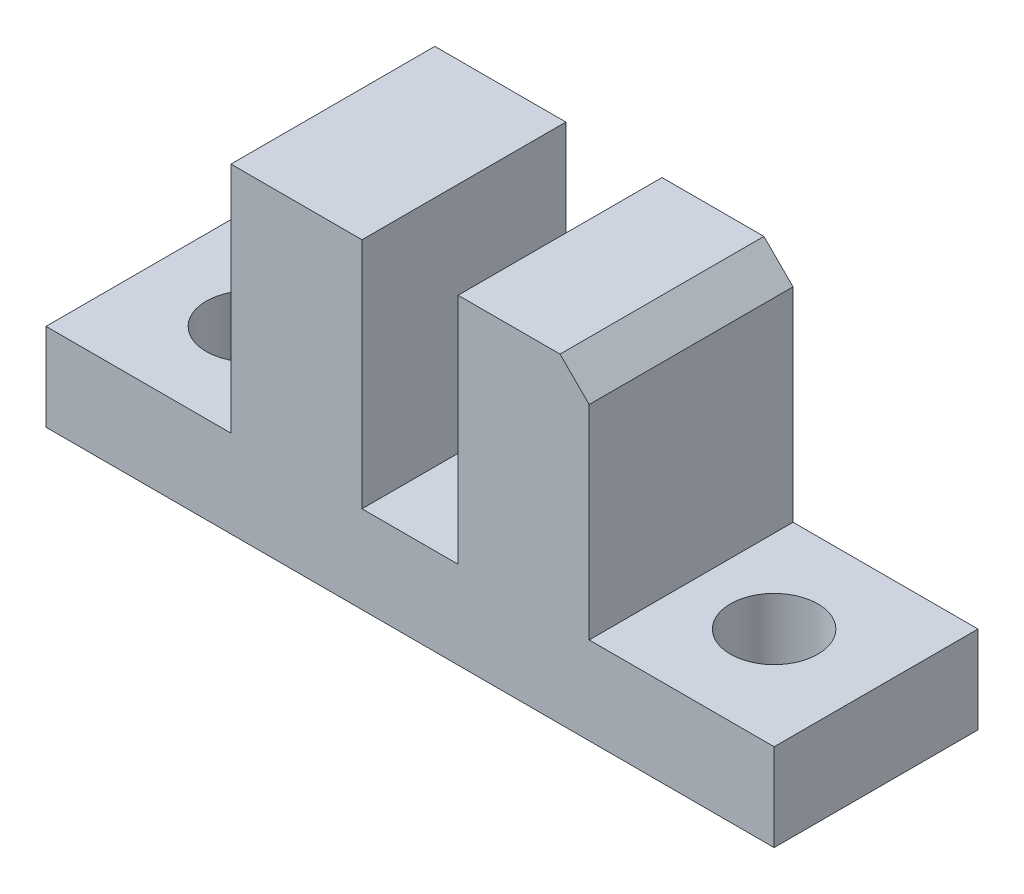
ISO-10303-21;
HEADER;
FILE_DESCRIPTION(('STEP AP214'),'2;1');
FILE_NAME('part.step','',(''),(''),'','','');
FILE_SCHEMA(('AUTOMOTIVE_DESIGN { 1 0 10303 214 1 1 1 1 }'));
ENDSEC;
DATA;
#1=APPLICATION_CONTEXT('core data for automotive mechanical design processes');
#2=APPLICATION_PROTOCOL_DEFINITION('international standard','automotive_design',2000,#1);
#3=PRODUCT_CONTEXT('',#1,'mechanical');
#4=PRODUCT('Part','Part','',(#3));
#5=PRODUCT_RELATED_PRODUCT_CATEGORY('part','',(#4));
#6=PRODUCT_DEFINITION_FORMATION('','',#4);
#7=PRODUCT_DEFINITION_CONTEXT('part definition',#1,'design');
#8=PRODUCT_DEFINITION('design','',#6,#7);
#9=PRODUCT_DEFINITION_SHAPE('','',#8);
#10=(LENGTH_UNIT() NAMED_UNIT(*) SI_UNIT(.MILLI.,.METRE.));
#11=(NAMED_UNIT(*) PLANE_ANGLE_UNIT() SI_UNIT($,.RADIAN.));
#12=(NAMED_UNIT(*) SI_UNIT($,.STERADIAN.) SOLID_ANGLE_UNIT());
#13=UNCERTAINTY_MEASURE_WITH_UNIT(LENGTH_MEASURE(1.E-05),#10,'distance_accuracy_value','');
#14=(GEOMETRIC_REPRESENTATION_CONTEXT(3) GLOBAL_UNCERTAINTY_ASSIGNED_CONTEXT((#13)) GLOBAL_UNIT_ASSIGNED_CONTEXT((#10,
#11,#12)) REPRESENTATION_CONTEXT('',''));
#15=CARTESIAN_POINT('',(0.,0.,0.));
#16=DIRECTION('',(0.,0.,1.));
#17=DIRECTION('',(1.,0.,0.));
#18=AXIS2_PLACEMENT_3D('',#15,#16,#17);
#19=CARTESIAN_POINT('',(0.,3.,0.));
#20=DIRECTION('',(0.,-1.,0.));
#21=DIRECTION('',(0.,0.,-1.));
#22=AXIS2_PLACEMENT_3D('',#19,#20,#21);
#23=PLANE('',#22);
#24=CARTESIAN_POINT('',(-9.00000000000001,3.,0.));
#25=DIRECTION('',(0.,1.,0.));
#26=DIRECTION('',(0.,0.,-1.));
#27=AXIS2_PLACEMENT_3D('',#24,#25,#26);
#28=CIRCLE('',#27,1.5);
#29=CARTESIAN_POINT('',(-9.00000000000001,3.,-1.5));
#30=VERTEX_POINT('',#29);
#31=EDGE_CURVE('E189',#30,#30,#28,.T.);
#32=ORIENTED_EDGE('',*,*,#31,.F.);
#33=EDGE_LOOP('',(#32));
#34=FACE_BOUND('',#33,.T.);
#35=DIRECTION('',(1.,0.,0.));
#36=VECTOR('',#35,1.);
#37=CARTESIAN_POINT('',(-12.5,3.,3.5));
#38=LINE('',#37,#36);
#39=CARTESIAN_POINT('',(-12.5,3.,3.5));
#40=VERTEX_POINT('',#39);
#41=CARTESIAN_POINT('',(-6.15,3.,3.5));
#42=VERTEX_POINT('',#41);
#43=EDGE_CURVE('E212',#40,#42,#38,.T.);
#44=ORIENTED_EDGE('',*,*,#43,.T.);
#45=DIRECTION('',(0.,0.,-1.));
#46=VECTOR('',#45,1.);
#47=CARTESIAN_POINT('',(-6.15,3.,0.));
#48=LINE('',#47,#46);
#49=CARTESIAN_POINT('',(-6.15,3.,-3.5));
#50=VERTEX_POINT('',#49);
#51=EDGE_CURVE('E164',#42,#50,#48,.T.);
#52=ORIENTED_EDGE('',*,*,#51,.T.);
#53=DIRECTION('',(-1.,0.,0.));
#54=VECTOR('',#53,1.);
#55=CARTESIAN_POINT('',(-12.5,3.,-3.5));
#56=LINE('',#55,#54);
#57=CARTESIAN_POINT('',(-12.5,3.,-3.5));
#58=VERTEX_POINT('',#57);
#59=EDGE_CURVE('E132',#50,#58,#56,.T.);
#60=ORIENTED_EDGE('',*,*,#59,.T.);
#61=DIRECTION('',(0.,0.,1.));
#62=VECTOR('',#61,1.);
#63=CARTESIAN_POINT('',(-12.5,3.,3.5));
#64=LINE('',#63,#62);
#65=EDGE_CURVE('E208',#58,#40,#64,.T.);
#66=ORIENTED_EDGE('',*,*,#65,.T.);
#67=EDGE_LOOP('',(#44,#52,#60,#66));
#68=FACE_BOUND('',#67,.T.);
#69=ADVANCED_FACE('F32',(#34,#68),#23,.F.);
#70=CARTESIAN_POINT('',(9.,3.,0.));
#71=DIRECTION('',(0.,1.,0.));
#72=DIRECTION('',(0.,0.,1.));
#73=AXIS2_PLACEMENT_3D('',#70,#71,#72);
#74=CIRCLE('',#73,1.5);
#75=CARTESIAN_POINT('',(9.,3.,1.5));
#76=VERTEX_POINT('',#75);
#77=EDGE_CURVE('E195',#76,#76,#74,.T.);
#78=ORIENTED_EDGE('',*,*,#77,.F.);
#79=EDGE_LOOP('',(#78));
#80=FACE_BOUND('',#79,.T.);
#81=CARTESIAN_POINT('',(12.5,3.,-3.5));
#82=VERTEX_POINT('',#81);
#83=CARTESIAN_POINT('',(6.15,3.,-3.5));
#84=VERTEX_POINT('',#83);
#85=EDGE_CURVE('E205',#82,#84,#56,.T.);
#86=ORIENTED_EDGE('',*,*,#85,.T.);
#87=DIRECTION('',(0.,0.,1.));
#88=VECTOR('',#87,1.);
#89=CARTESIAN_POINT('',(6.15,3.,0.));
#90=LINE('',#89,#88);
#91=CARTESIAN_POINT('',(6.15,3.,3.5));
#92=VERTEX_POINT('',#91);
#93=EDGE_CURVE('E185',#84,#92,#90,.T.);
#94=ORIENTED_EDGE('',*,*,#93,.T.);
#95=CARTESIAN_POINT('',(12.5,3.,3.5));
#96=VERTEX_POINT('',#95);
#97=EDGE_CURVE('E211',#92,#96,#38,.T.);
#98=ORIENTED_EDGE('',*,*,#97,.T.);
#99=DIRECTION('',(0.,0.,-1.));
#100=VECTOR('',#99,1.);
#101=CARTESIAN_POINT('',(12.5,3.,3.5));
#102=LINE('',#101,#100);
#103=EDGE_CURVE('E201',#96,#82,#102,.T.);
#104=ORIENTED_EDGE('',*,*,#103,.T.);
#105=EDGE_LOOP('',(#86,#94,#98,#104));
#106=FACE_BOUND('',#105,.T.);
#107=ADVANCED_FACE('F279',(#80,#106),#23,.F.);
#108=CARTESIAN_POINT('',(1.65,3.,-3.5));
#109=VERTEX_POINT('',#108);
#110=CARTESIAN_POINT('',(-1.65,3.,-3.5));
#111=VERTEX_POINT('',#110);
#112=EDGE_CURVE('E209',#109,#111,#56,.T.);
#113=ORIENTED_EDGE('',*,*,#112,.T.);
#114=DIRECTION('',(0.,0.,1.));
#115=VECTOR('',#114,1.);
#116=CARTESIAN_POINT('',(-1.65,3.,0.));
#117=LINE('',#116,#115);
#118=CARTESIAN_POINT('',(-1.65,3.,3.5));
#119=VERTEX_POINT('',#118);
#120=EDGE_CURVE('E158',#111,#119,#117,.T.);
#121=ORIENTED_EDGE('',*,*,#120,.T.);
#122=CARTESIAN_POINT('',(1.65,3.,3.5));
#123=VERTEX_POINT('',#122);
#124=EDGE_CURVE('E215',#119,#123,#38,.T.);
#125=ORIENTED_EDGE('',*,*,#124,.T.);
#126=DIRECTION('',(0.,0.,-1.));
#127=VECTOR('',#126,1.);
#128=CARTESIAN_POINT('',(1.65,3.,0.));
#129=LINE('',#128,#127);
#130=EDGE_CURVE('E176',#123,#109,#129,.T.);
#131=ORIENTED_EDGE('',*,*,#130,.T.);
#132=EDGE_LOOP('',(#113,#121,#125,#131));
#133=FACE_BOUND('',#132,.T.);
#134=ADVANCED_FACE('F252',(#133),#23,.F.);
#135=CARTESIAN_POINT('',(0.,0.,0.));
#136=DIRECTION('',(0.,-1.,0.));
#137=DIRECTION('',(0.,0.,-1.));
#138=AXIS2_PLACEMENT_3D('',#135,#136,#137);
#139=PLANE('',#138);
#140=DIRECTION('',(0.,0.,-1.));
#141=VECTOR('',#140,1.);
#142=CARTESIAN_POINT('',(12.5,0.,3.5));
#143=LINE('',#142,#141);
#144=CARTESIAN_POINT('',(12.5,0.,3.5));
#145=VERTEX_POINT('',#144);
#146=CARTESIAN_POINT('',(12.5,0.,-3.5));
#147=VERTEX_POINT('',#146);
#148=EDGE_CURVE('E198',#145,#147,#143,.T.);
#149=ORIENTED_EDGE('',*,*,#148,.F.);
#150=DIRECTION('',(1.,0.,0.));
#151=VECTOR('',#150,1.);
#152=CARTESIAN_POINT('',(-12.5,0.,3.5));
#153=LINE('',#152,#151);
#154=CARTESIAN_POINT('',(-12.5,0.,3.5));
#155=VERTEX_POINT('',#154);
#156=EDGE_CURVE('E204',#155,#145,#153,.T.);
#157=ORIENTED_EDGE('',*,*,#156,.F.);
#158=DIRECTION('',(0.,0.,1.));
#159=VECTOR('',#158,1.);
#160=CARTESIAN_POINT('',(-12.5,0.,3.5));
#161=LINE('',#160,#159);
#162=CARTESIAN_POINT('',(-12.5,0.,-3.5));
#163=VERTEX_POINT('',#162);
#164=EDGE_CURVE('E220',#163,#155,#161,.T.);
#165=ORIENTED_EDGE('',*,*,#164,.F.);
#166=DIRECTION('',(-1.,0.,0.));
#167=VECTOR('',#166,1.);
#168=CARTESIAN_POINT('',(-12.5,0.,-3.5));
#169=LINE('',#168,#167);
#170=EDGE_CURVE('E218',#147,#163,#169,.T.);
#171=ORIENTED_EDGE('',*,*,#170,.F.);
#172=EDGE_LOOP('',(#149,#157,#165,#171));
#173=FACE_BOUND('',#172,.T.);
#174=CARTESIAN_POINT('',(9.,0.,0.));
#175=DIRECTION('',(0.,1.,0.));
#176=DIRECTION('',(0.,0.,1.));
#177=AXIS2_PLACEMENT_3D('',#174,#175,#176);
#178=CIRCLE('',#177,1.5);
#179=CARTESIAN_POINT('',(9.,0.,1.5));
#180=VERTEX_POINT('',#179);
#181=EDGE_CURVE('E192',#180,#180,#178,.T.);
#182=ORIENTED_EDGE('',*,*,#181,.T.);
#183=EDGE_LOOP('',(#182));
#184=FACE_BOUND('',#183,.T.);
#185=CARTESIAN_POINT('',(-9.00000000000001,0.,0.));
#186=DIRECTION('',(0.,1.,0.));
#187=DIRECTION('',(0.,0.,-1.));
#188=AXIS2_PLACEMENT_3D('',#185,#186,#187);
#189=CIRCLE('',#188,1.5);
#190=CARTESIAN_POINT('',(-9.00000000000001,0.,-1.5));
#191=VERTEX_POINT('',#190);
#192=EDGE_CURVE('E188',#191,#191,#189,.T.);
#193=ORIENTED_EDGE('',*,*,#192,.T.);
#194=EDGE_LOOP('',(#193));
#195=FACE_BOUND('',#194,.T.);
#196=ADVANCED_FACE('F290',(#173,#184,#195),#139,.T.);
#197=CARTESIAN_POINT('',(12.5,3.,3.5));
#198=DIRECTION('',(-1.,0.,0.));
#199=DIRECTION('',(0.,0.,1.));
#200=AXIS2_PLACEMENT_3D('',#197,#198,#199);
#201=PLANE('',#200);
#202=ORIENTED_EDGE('',*,*,#148,.T.);
#203=DIRECTION('',(0.,-1.,0.));
#204=VECTOR('',#203,1.);
#205=CARTESIAN_POINT('',(12.5,3.,-3.5));
#206=LINE('',#205,#204);
#207=EDGE_CURVE('E231',#82,#147,#206,.T.);
#208=ORIENTED_EDGE('',*,*,#207,.F.);
#209=ORIENTED_EDGE('',*,*,#103,.F.);
#210=DIRECTION('',(0.,-1.,0.));
#211=VECTOR('',#210,1.);
#212=CARTESIAN_POINT('',(12.5,3.,3.5));
#213=LINE('',#212,#211);
#214=EDGE_CURVE('E214',#96,#145,#213,.T.);
#215=ORIENTED_EDGE('',*,*,#214,.T.);
#216=EDGE_LOOP('',(#202,#208,#209,#215));
#217=FACE_BOUND('',#216,.T.);
#218=ADVANCED_FACE('F294',(#217),#201,.F.);
#219=CARTESIAN_POINT('',(-12.5,3.,-3.5));
#220=DIRECTION('',(0.,0.,1.));
#221=DIRECTION('',(1.,0.,0.));
#222=AXIS2_PLACEMENT_3D('',#219,#220,#221);
#223=PLANE('',#222);
#224=DIRECTION('',(1.,0.,0.));
#225=VECTOR('',#224,1.);
#226=CARTESIAN_POINT('',(1.65,11.,-3.5));
#227=LINE('',#226,#225);
#228=CARTESIAN_POINT('',(1.65,11.,-3.5));
#229=VERTEX_POINT('',#228);
#230=CARTESIAN_POINT('',(5.15,11.,-3.5));
#231=VERTEX_POINT('',#230);
#232=EDGE_CURVE('E171',#229,#231,#227,.T.);
#233=ORIENTED_EDGE('',*,*,#232,.T.);
#234=DIRECTION('',(0.707106781186549,-0.707106781186546,0.));
#235=VECTOR('',#234,1.);
#236=CARTESIAN_POINT('',(6.15,10.,-3.5));
#237=LINE('',#236,#235);
#238=CARTESIAN_POINT('',(6.15,10.,-3.5));
#239=VERTEX_POINT('',#238);
#240=EDGE_CURVE('E11',#231,#239,#237,.T.);
#241=ORIENTED_EDGE('',*,*,#240,.T.);
#242=DIRECTION('',(0.,-1.,0.));
#243=VECTOR('',#242,1.);
#244=CARTESIAN_POINT('',(6.15,11.,-3.5));
#245=LINE('',#244,#243);
#246=EDGE_CURVE('E177',#239,#84,#245,.T.);
#247=ORIENTED_EDGE('',*,*,#246,.T.);
#248=ORIENTED_EDGE('',*,*,#85,.F.);
#249=ORIENTED_EDGE('',*,*,#207,.T.);
#250=ORIENTED_EDGE('',*,*,#170,.T.);
#251=DIRECTION('',(0.,-1.,0.));
#252=VECTOR('',#251,1.);
#253=CARTESIAN_POINT('',(-12.5,3.,-3.5));
#254=LINE('',#253,#252);
#255=EDGE_CURVE('E228',#58,#163,#254,.T.);
#256=ORIENTED_EDGE('',*,*,#255,.F.);
#257=ORIENTED_EDGE('',*,*,#59,.F.);
#258=DIRECTION('',(0.,-1.,0.));
#259=VECTOR('',#258,1.);
#260=CARTESIAN_POINT('',(-6.15,11.,-3.5));
#261=LINE('',#260,#259);
#262=CARTESIAN_POINT('',(-6.15,11.,-3.5));
#263=VERTEX_POINT('',#262);
#264=EDGE_CURVE('E126',#263,#50,#261,.T.);
#265=ORIENTED_EDGE('',*,*,#264,.F.);
#266=DIRECTION('',(1.,0.,0.));
#267=VECTOR('',#266,1.);
#268=CARTESIAN_POINT('',(-6.15,11.,-3.5));
#269=LINE('',#268,#267);
#270=CARTESIAN_POINT('',(-1.65,11.,-3.5));
#271=VERTEX_POINT('',#270);
#272=EDGE_CURVE('E130',#263,#271,#269,.T.);
#273=ORIENTED_EDGE('',*,*,#272,.T.);
#274=DIRECTION('',(0.,-1.,0.));
#275=VECTOR('',#274,1.);
#276=CARTESIAN_POINT('',(-1.65,11.,-3.5));
#277=LINE('',#276,#275);
#278=EDGE_CURVE('E137',#271,#111,#277,.T.);
#279=ORIENTED_EDGE('',*,*,#278,.T.);
#280=ORIENTED_EDGE('',*,*,#112,.F.);
#281=DIRECTION('',(0.,-1.,0.));
#282=VECTOR('',#281,1.);
#283=CARTESIAN_POINT('',(1.65,11.,-3.5));
#284=LINE('',#283,#282);
#285=EDGE_CURVE('E179',#229,#109,#284,.T.);
#286=ORIENTED_EDGE('',*,*,#285,.F.);
#287=EDGE_LOOP('',(#233,#241,#247,#248,#249,#250,#256,#257,#265,#273,#279,#280,#286));
#288=FACE_BOUND('',#287,.T.);
#289=ADVANCED_FACE('F128',(#288),#223,.F.);
#290=CARTESIAN_POINT('',(-12.5,3.,3.5));
#291=DIRECTION('',(1.,0.,0.));
#292=DIRECTION('',(0.,0.,-1.));
#293=AXIS2_PLACEMENT_3D('',#290,#291,#292);
#294=PLANE('',#293);
#295=ORIENTED_EDGE('',*,*,#164,.T.);
#296=DIRECTION('',(0.,-1.,0.));
#297=VECTOR('',#296,1.);
#298=CARTESIAN_POINT('',(-12.5,3.,3.5));
#299=LINE('',#298,#297);
#300=EDGE_CURVE('E225',#40,#155,#299,.T.);
#301=ORIENTED_EDGE('',*,*,#300,.F.);
#302=ORIENTED_EDGE('',*,*,#65,.F.);
#303=ORIENTED_EDGE('',*,*,#255,.T.);
#304=EDGE_LOOP('',(#295,#301,#302,#303));
#305=FACE_BOUND('',#304,.T.);
#306=ADVANCED_FACE('F265',(#305),#294,.F.);
#307=CARTESIAN_POINT('',(-12.5,3.,3.5));
#308=DIRECTION('',(0.,0.,-1.));
#309=DIRECTION('',(-1.,0.,0.));
#310=AXIS2_PLACEMENT_3D('',#307,#308,#309);
#311=PLANE('',#310);
#312=DIRECTION('',(0.,-1.,0.));
#313=VECTOR('',#312,1.);
#314=CARTESIAN_POINT('',(6.15,11.,3.5));
#315=LINE('',#314,#313);
#316=CARTESIAN_POINT('',(6.15,10.,3.5));
#317=VERTEX_POINT('',#316);
#318=EDGE_CURVE('E174',#317,#92,#315,.T.);
#319=ORIENTED_EDGE('',*,*,#318,.F.);
#320=DIRECTION('',(-0.707106781186549,0.707106781186546,0.));
#321=VECTOR('',#320,1.);
#322=CARTESIAN_POINT('',(6.15,10.,3.5));
#323=LINE('',#322,#321);
#324=CARTESIAN_POINT('',(5.15,11.,3.5));
#325=VERTEX_POINT('',#324);
#326=EDGE_CURVE('E54',#317,#325,#323,.T.);
#327=ORIENTED_EDGE('',*,*,#326,.T.);
#328=DIRECTION('',(-1.,0.,0.));
#329=VECTOR('',#328,1.);
#330=CARTESIAN_POINT('',(1.65,11.,3.5));
#331=LINE('',#330,#329);
#332=CARTESIAN_POINT('',(1.65,11.,3.5));
#333=VERTEX_POINT('',#332);
#334=EDGE_CURVE('E166',#325,#333,#331,.T.);
#335=ORIENTED_EDGE('',*,*,#334,.T.);
#336=DIRECTION('',(0.,-1.,0.));
#337=VECTOR('',#336,1.);
#338=CARTESIAN_POINT('',(1.65,11.,3.5));
#339=LINE('',#338,#337);
#340=EDGE_CURVE('E173',#333,#123,#339,.T.);
#341=ORIENTED_EDGE('',*,*,#340,.T.);
#342=ORIENTED_EDGE('',*,*,#124,.F.);
#343=DIRECTION('',(0.,-1.,0.));
#344=VECTOR('',#343,1.);
#345=CARTESIAN_POINT('',(-1.65,11.,3.5));
#346=LINE('',#345,#344);
#347=CARTESIAN_POINT('',(-1.65,11.,3.5));
#348=VERTEX_POINT('',#347);
#349=EDGE_CURVE('E159',#348,#119,#346,.T.);
#350=ORIENTED_EDGE('',*,*,#349,.F.);
#351=DIRECTION('',(-1.,0.,0.));
#352=VECTOR('',#351,1.);
#353=CARTESIAN_POINT('',(-6.15,11.,3.5));
#354=LINE('',#353,#352);
#355=CARTESIAN_POINT('',(-6.15,11.,3.5));
#356=VERTEX_POINT('',#355);
#357=EDGE_CURVE('E138',#348,#356,#354,.T.);
#358=ORIENTED_EDGE('',*,*,#357,.T.);
#359=DIRECTION('',(0.,-1.,0.));
#360=VECTOR('',#359,1.);
#361=CARTESIAN_POINT('',(-6.15,11.,3.5));
#362=LINE('',#361,#360);
#363=EDGE_CURVE('E152',#356,#42,#362,.T.);
#364=ORIENTED_EDGE('',*,*,#363,.T.);
#365=ORIENTED_EDGE('',*,*,#43,.F.);
#366=ORIENTED_EDGE('',*,*,#300,.T.);
#367=ORIENTED_EDGE('',*,*,#156,.T.);
#368=ORIENTED_EDGE('',*,*,#214,.F.);
#369=ORIENTED_EDGE('',*,*,#97,.F.);
#370=EDGE_LOOP('',(#319,#327,#335,#341,#342,#350,#358,#364,#365,#366,#367,#368,#369));
#371=FACE_BOUND('',#370,.T.);
#372=ADVANCED_FACE('F245',(#371),#311,.F.);
#373=CARTESIAN_POINT('',(9.,3.,0.));
#374=DIRECTION('',(0.,-1.,0.));
#375=DIRECTION('',(0.,0.,-1.));
#376=AXIS2_PLACEMENT_3D('',#373,#374,#375);
#377=CYLINDRICAL_SURFACE('',#376,1.5);
#378=ORIENTED_EDGE('',*,*,#77,.T.);
#379=EDGE_LOOP('',(#378));
#380=FACE_BOUND('',#379,.T.);
#381=ORIENTED_EDGE('',*,*,#181,.F.);
#382=EDGE_LOOP('',(#381));
#383=FACE_BOUND('',#382,.T.);
#384=ADVANCED_FACE('F305',(#380,#383),#377,.F.);
#385=CARTESIAN_POINT('',(-9.00000000000001,3.,0.));
#386=DIRECTION('',(0.,-1.,0.));
#387=DIRECTION('',(0.,0.,-1.));
#388=AXIS2_PLACEMENT_3D('',#385,#386,#387);
#389=CYLINDRICAL_SURFACE('',#388,1.5);
#390=ORIENTED_EDGE('',*,*,#31,.T.);
#391=EDGE_LOOP('',(#390));
#392=FACE_BOUND('',#391,.T.);
#393=ORIENTED_EDGE('',*,*,#192,.F.);
#394=EDGE_LOOP('',(#393));
#395=FACE_BOUND('',#394,.T.);
#396=ADVANCED_FACE('F329',(#392,#395),#389,.F.);
#397=CARTESIAN_POINT('',(6.15,11.,-3.5));
#398=DIRECTION('',(1.,0.,0.));
#399=DIRECTION('',(0.,0.,-1.));
#400=AXIS2_PLACEMENT_3D('',#397,#398,#399);
#401=PLANE('',#400);
#402=ORIENTED_EDGE('',*,*,#246,.F.);
#403=DIRECTION('',(0.,0.,1.));
#404=VECTOR('',#403,1.);
#405=CARTESIAN_POINT('',(6.15,10.,3.5));
#406=LINE('',#405,#404);
#407=EDGE_CURVE('E234',#239,#317,#406,.T.);
#408=ORIENTED_EDGE('',*,*,#407,.T.);
#409=ORIENTED_EDGE('',*,*,#318,.T.);
#410=ORIENTED_EDGE('',*,*,#93,.F.);
#411=EDGE_LOOP('',(#402,#408,#409,#410));
#412=FACE_BOUND('',#411,.T.);
#413=ADVANCED_FACE('F240',(#412),#401,.T.);
#414=CARTESIAN_POINT('',(1.65,11.,-3.5));
#415=DIRECTION('',(-1.,0.,0.));
#416=DIRECTION('',(0.,0.,1.));
#417=AXIS2_PLACEMENT_3D('',#414,#415,#416);
#418=PLANE('',#417);
#419=ORIENTED_EDGE('',*,*,#130,.F.);
#420=ORIENTED_EDGE('',*,*,#340,.F.);
#421=DIRECTION('',(0.,0.,-1.));
#422=VECTOR('',#421,1.);
#423=CARTESIAN_POINT('',(1.65,11.,-3.5));
#424=LINE('',#423,#422);
#425=EDGE_CURVE('E168',#333,#229,#424,.T.);
#426=ORIENTED_EDGE('',*,*,#425,.T.);
#427=ORIENTED_EDGE('',*,*,#285,.T.);
#428=EDGE_LOOP('',(#419,#420,#426,#427));
#429=FACE_BOUND('',#428,.T.);
#430=ADVANCED_FACE('F257',(#429),#418,.T.);
#431=CARTESIAN_POINT('',(0.,11.,0.));
#432=DIRECTION('',(0.,-1.,0.));
#433=DIRECTION('',(0.,0.,-1.));
#434=AXIS2_PLACEMENT_3D('',#431,#432,#433);
#435=PLANE('',#434);
#436=ORIENTED_EDGE('',*,*,#334,.F.);
#437=DIRECTION('',(0.,0.,-1.));
#438=VECTOR('',#437,1.);
#439=CARTESIAN_POINT('',(5.15,11.,-3.5));
#440=LINE('',#439,#438);
#441=EDGE_CURVE('E40',#325,#231,#440,.T.);
#442=ORIENTED_EDGE('',*,*,#441,.T.);
#443=ORIENTED_EDGE('',*,*,#232,.F.);
#444=ORIENTED_EDGE('',*,*,#425,.F.);
#445=EDGE_LOOP('',(#436,#442,#443,#444));
#446=FACE_BOUND('',#445,.T.);
#447=ADVANCED_FACE('F259',(#446),#435,.F.);
#448=CARTESIAN_POINT('',(-6.15,11.,-3.5));
#449=DIRECTION('',(-1.,0.,0.));
#450=DIRECTION('',(0.,0.,1.));
#451=AXIS2_PLACEMENT_3D('',#448,#449,#450);
#452=PLANE('',#451);
#453=ORIENTED_EDGE('',*,*,#51,.F.);
#454=ORIENTED_EDGE('',*,*,#363,.F.);
#455=DIRECTION('',(0.,0.,-1.));
#456=VECTOR('',#455,1.);
#457=CARTESIAN_POINT('',(-6.15,11.,-3.5));
#458=LINE('',#457,#456);
#459=EDGE_CURVE('E145',#356,#263,#458,.T.);
#460=ORIENTED_EDGE('',*,*,#459,.T.);
#461=ORIENTED_EDGE('',*,*,#264,.T.);
#462=EDGE_LOOP('',(#453,#454,#460,#461));
#463=FACE_BOUND('',#462,.T.);
#464=ADVANCED_FACE('F150',(#463),#452,.T.);
#465=CARTESIAN_POINT('',(-1.65,11.,-3.5));
#466=DIRECTION('',(1.,0.,0.));
#467=DIRECTION('',(0.,0.,-1.));
#468=AXIS2_PLACEMENT_3D('',#465,#466,#467);
#469=PLANE('',#468);
#470=ORIENTED_EDGE('',*,*,#120,.F.);
#471=ORIENTED_EDGE('',*,*,#278,.F.);
#472=DIRECTION('',(0.,0.,1.));
#473=VECTOR('',#472,1.);
#474=CARTESIAN_POINT('',(-1.65,11.,-3.5));
#475=LINE('',#474,#473);
#476=EDGE_CURVE('E148',#271,#348,#475,.T.);
#477=ORIENTED_EDGE('',*,*,#476,.T.);
#478=ORIENTED_EDGE('',*,*,#349,.T.);
#479=EDGE_LOOP('',(#470,#471,#477,#478));
#480=FACE_BOUND('',#479,.T.);
#481=ADVANCED_FACE('F269',(#480),#469,.T.);
#482=CARTESIAN_POINT('',(0.,11.,0.));
#483=DIRECTION('',(0.,1.,0.));
#484=DIRECTION('',(0.,0.,1.));
#485=AXIS2_PLACEMENT_3D('',#482,#483,#484);
#486=PLANE('',#485);
#487=ORIENTED_EDGE('',*,*,#459,.F.);
#488=ORIENTED_EDGE('',*,*,#357,.F.);
#489=ORIENTED_EDGE('',*,*,#476,.F.);
#490=ORIENTED_EDGE('',*,*,#272,.F.);
#491=EDGE_LOOP('',(#487,#488,#489,#490));
#492=FACE_BOUND('',#491,.T.);
#493=ADVANCED_FACE('F143',(#492),#486,.T.);
#494=CARTESIAN_POINT('',(6.15,10.,-3.5));
#495=DIRECTION('',(0.707106781186546,0.707106781186549,0.));
#496=DIRECTION('',(0.,0.,-1.));
#497=AXIS2_PLACEMENT_3D('',#494,#495,#496);
#498=PLANE('',#497);
#499=ORIENTED_EDGE('',*,*,#240,.F.);
#500=ORIENTED_EDGE('',*,*,#441,.F.);
#501=ORIENTED_EDGE('',*,*,#326,.F.);
#502=ORIENTED_EDGE('',*,*,#407,.F.);
#503=EDGE_LOOP('',(#499,#500,#501,#502));
#504=FACE_BOUND('',#503,.T.);
#505=ADVANCED_FACE('F34',(#504),#498,.T.);
#506=CLOSED_SHELL('',(#69,#107,#134,#196,#218,#289,#306,#372,#384,#396,#413,#430,#447,#464,#481,
#493,#505));
#507=MANIFOLD_SOLID_BREP('B2',#506);
#508=ADVANCED_BREP_SHAPE_REPRESENTATION('',(#18,#507),#14);
#509=SHAPE_DEFINITION_REPRESENTATION(#9,#508);
ENDSEC;
END-ISO-10303-21;
